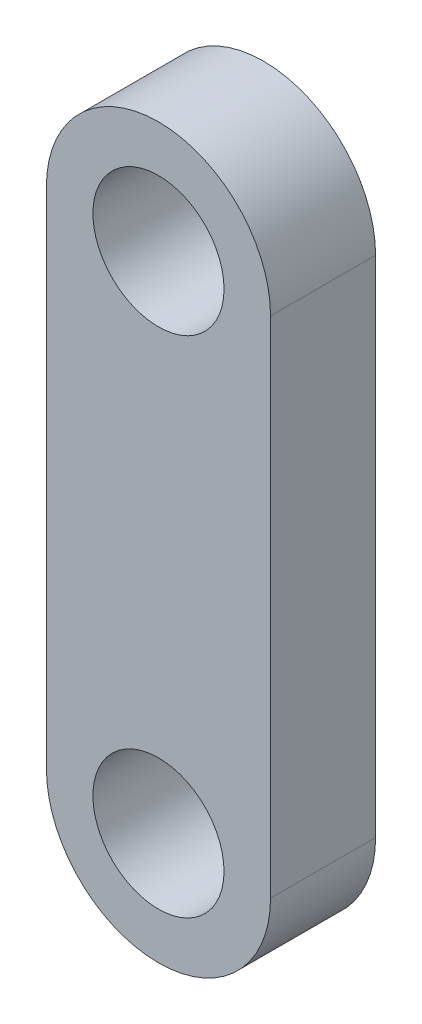
ISO-10303-21;
HEADER;
FILE_DESCRIPTION(('STEP AP214'),'2;1');
FILE_NAME('part.step','',(''),(''),'','','');
FILE_SCHEMA(('AUTOMOTIVE_DESIGN { 1 0 10303 214 1 1 1 1 }'));
ENDSEC;
DATA;
#1=APPLICATION_CONTEXT('core data for automotive mechanical design processes');
#2=APPLICATION_PROTOCOL_DEFINITION('international standard','automotive_design',2000,#1);
#3=PRODUCT_CONTEXT('',#1,'mechanical');
#4=PRODUCT('Part','Part','',(#3));
#5=PRODUCT_RELATED_PRODUCT_CATEGORY('part','',(#4));
#6=PRODUCT_DEFINITION_FORMATION('','',#4);
#7=PRODUCT_DEFINITION_CONTEXT('part definition',#1,'design');
#8=PRODUCT_DEFINITION('design','',#6,#7);
#9=PRODUCT_DEFINITION_SHAPE('','',#8);
#10=(LENGTH_UNIT() NAMED_UNIT(*) SI_UNIT(.MILLI.,.METRE.));
#11=(NAMED_UNIT(*) PLANE_ANGLE_UNIT() SI_UNIT($,.RADIAN.));
#12=(NAMED_UNIT(*) SI_UNIT($,.STERADIAN.) SOLID_ANGLE_UNIT());
#13=UNCERTAINTY_MEASURE_WITH_UNIT(LENGTH_MEASURE(1.E-05),#10,'distance_accuracy_value','');
#14=(GEOMETRIC_REPRESENTATION_CONTEXT(3) GLOBAL_UNCERTAINTY_ASSIGNED_CONTEXT((#13)) GLOBAL_UNIT_ASSIGNED_CONTEXT((#10,
#11,#12)) REPRESENTATION_CONTEXT('',''));
#15=CARTESIAN_POINT('',(0.,0.,0.));
#16=DIRECTION('',(0.,0.,1.));
#17=DIRECTION('',(1.,0.,0.));
#18=AXIS2_PLACEMENT_3D('',#15,#16,#17);
#19=CARTESIAN_POINT('',(0.,14.4,3.));
#20=DIRECTION('',(0.,0.,1.));
#21=DIRECTION('',(1.,0.,0.));
#22=AXIS2_PLACEMENT_3D('',#19,#20,#21);
#23=PLANE('',#22);
#24=CARTESIAN_POINT('',(0.,0.,3.));
#25=DIRECTION('',(0.,0.,1.));
#26=DIRECTION('',(1.,0.,0.));
#27=AXIS2_PLACEMENT_3D('',#24,#25,#26);
#28=CIRCLE('',#27,1.872);
#29=CARTESIAN_POINT('',(1.872,0.,3.));
#30=VERTEX_POINT('',#29);
#31=EDGE_CURVE('E108',#30,#30,#28,.T.);
#32=ORIENTED_EDGE('',*,*,#31,.F.);
#33=EDGE_LOOP('',(#32));
#34=FACE_BOUND('',#33,.T.);
#35=CARTESIAN_POINT('',(0.,14.4,3.));
#36=DIRECTION('',(0.,0.,1.));
#37=DIRECTION('',(1.,0.,0.));
#38=AXIS2_PLACEMENT_3D('',#35,#36,#37);
#39=CIRCLE('',#38,3.2);
#40=CARTESIAN_POINT('',(3.2,14.4,3.));
#41=VERTEX_POINT('',#40);
#42=CARTESIAN_POINT('',(-3.2,14.4,3.));
#43=VERTEX_POINT('',#42);
#44=EDGE_CURVE('E93',#41,#43,#39,.T.);
#45=ORIENTED_EDGE('',*,*,#44,.T.);
#46=DIRECTION('',(0.,-1.,0.));
#47=VECTOR('',#46,1.);
#48=CARTESIAN_POINT('',(-3.2,14.4,3.));
#49=LINE('',#48,#47);
#50=CARTESIAN_POINT('',(-3.2,0.,3.));
#51=VERTEX_POINT('',#50);
#52=EDGE_CURVE('E88',#43,#51,#49,.T.);
#53=ORIENTED_EDGE('',*,*,#52,.T.);
#54=CARTESIAN_POINT('',(0.,0.,3.));
#55=DIRECTION('',(0.,0.,1.));
#56=DIRECTION('',(1.,0.,0.));
#57=AXIS2_PLACEMENT_3D('',#54,#55,#56);
#58=CIRCLE('',#57,3.2);
#59=CARTESIAN_POINT('',(3.19999999999999,0.,3.));
#60=VERTEX_POINT('',#59);
#61=EDGE_CURVE('E91',#51,#60,#58,.T.);
#62=ORIENTED_EDGE('',*,*,#61,.T.);
#63=DIRECTION('',(0.,1.,0.));
#64=VECTOR('',#63,1.);
#65=CARTESIAN_POINT('',(3.2,14.4,3.));
#66=LINE('',#65,#64);
#67=EDGE_CURVE('E58',#60,#41,#66,.T.);
#68=ORIENTED_EDGE('',*,*,#67,.T.);
#69=EDGE_LOOP('',(#45,#53,#62,#68));
#70=FACE_BOUND('',#69,.T.);
#71=CARTESIAN_POINT('',(0.,14.4,3.));
#72=DIRECTION('',(0.,0.,1.));
#73=DIRECTION('',(1.,0.,0.));
#74=AXIS2_PLACEMENT_3D('',#71,#72,#73);
#75=CIRCLE('',#74,1.872);
#76=CARTESIAN_POINT('',(1.872,14.4,3.));
#77=VERTEX_POINT('',#76);
#78=EDGE_CURVE('E123',#77,#77,#75,.T.);
#79=ORIENTED_EDGE('',*,*,#78,.F.);
#80=EDGE_LOOP('',(#79));
#81=FACE_BOUND('',#80,.T.);
#82=ADVANCED_FACE('F41',(#34,#70,#81),#23,.T.);
#83=CARTESIAN_POINT('',(0.,14.4,0.));
#84=DIRECTION('',(0.,0.,1.));
#85=DIRECTION('',(1.,0.,0.));
#86=AXIS2_PLACEMENT_3D('',#83,#84,#85);
#87=PLANE('',#86);
#88=CARTESIAN_POINT('',(0.,14.4,0.));
#89=DIRECTION('',(0.,0.,1.));
#90=DIRECTION('',(1.,0.,0.));
#91=AXIS2_PLACEMENT_3D('',#88,#89,#90);
#92=CIRCLE('',#91,3.2);
#93=CARTESIAN_POINT('',(3.2,14.4,0.));
#94=VERTEX_POINT('',#93);
#95=CARTESIAN_POINT('',(-3.2,14.4,0.));
#96=VERTEX_POINT('',#95);
#97=EDGE_CURVE('E105',#94,#96,#92,.T.);
#98=ORIENTED_EDGE('',*,*,#97,.F.);
#99=DIRECTION('',(0.,1.,0.));
#100=VECTOR('',#99,1.);
#101=CARTESIAN_POINT('',(3.2,14.4,0.));
#102=LINE('',#101,#100);
#103=CARTESIAN_POINT('',(3.19999999999999,0.,0.));
#104=VERTEX_POINT('',#103);
#105=EDGE_CURVE('E81',#104,#94,#102,.T.);
#106=ORIENTED_EDGE('',*,*,#105,.F.);
#107=CARTESIAN_POINT('',(0.,0.,0.));
#108=DIRECTION('',(0.,0.,1.));
#109=DIRECTION('',(1.,0.,0.));
#110=AXIS2_PLACEMENT_3D('',#107,#108,#109);
#111=CIRCLE('',#110,3.2);
#112=CARTESIAN_POINT('',(-3.2,0.,0.));
#113=VERTEX_POINT('',#112);
#114=EDGE_CURVE('E75',#113,#104,#111,.T.);
#115=ORIENTED_EDGE('',*,*,#114,.F.);
#116=DIRECTION('',(0.,-1.,0.));
#117=VECTOR('',#116,1.);
#118=CARTESIAN_POINT('',(-3.2,14.4,0.));
#119=LINE('',#118,#117);
#120=EDGE_CURVE('E97',#96,#113,#119,.T.);
#121=ORIENTED_EDGE('',*,*,#120,.F.);
#122=EDGE_LOOP('',(#98,#106,#115,#121));
#123=FACE_BOUND('',#122,.T.);
#124=CARTESIAN_POINT('',(0.,0.,0.));
#125=DIRECTION('',(0.,0.,1.));
#126=DIRECTION('',(1.,0.,0.));
#127=AXIS2_PLACEMENT_3D('',#124,#125,#126);
#128=CIRCLE('',#127,1.872);
#129=CARTESIAN_POINT('',(1.872,0.,0.));
#130=VERTEX_POINT('',#129);
#131=EDGE_CURVE('E120',#130,#130,#128,.T.);
#132=ORIENTED_EDGE('',*,*,#131,.T.);
#133=EDGE_LOOP('',(#132));
#134=FACE_BOUND('',#133,.T.);
#135=CARTESIAN_POINT('',(0.,14.4,0.));
#136=DIRECTION('',(0.,0.,1.));
#137=DIRECTION('',(1.,0.,0.));
#138=AXIS2_PLACEMENT_3D('',#135,#136,#137);
#139=CIRCLE('',#138,1.872);
#140=CARTESIAN_POINT('',(1.872,14.4,0.));
#141=VERTEX_POINT('',#140);
#142=EDGE_CURVE('E126',#141,#141,#139,.T.);
#143=ORIENTED_EDGE('',*,*,#142,.T.);
#144=EDGE_LOOP('',(#143));
#145=FACE_BOUND('',#144,.T.);
#146=ADVANCED_FACE('F116',(#123,#134,#145),#87,.F.);
#147=CARTESIAN_POINT('',(0.,14.4,3.));
#148=DIRECTION('',(0.,0.,-1.));
#149=DIRECTION('',(-1.,0.,0.));
#150=AXIS2_PLACEMENT_3D('',#147,#148,#149);
#151=CYLINDRICAL_SURFACE('',#150,3.2);
#152=ORIENTED_EDGE('',*,*,#97,.T.);
#153=DIRECTION('',(0.,0.,-1.));
#154=VECTOR('',#153,1.);
#155=CARTESIAN_POINT('',(-3.2,14.4,3.));
#156=LINE('',#155,#154);
#157=EDGE_CURVE('E11',#43,#96,#156,.T.);
#158=ORIENTED_EDGE('',*,*,#157,.F.);
#159=ORIENTED_EDGE('',*,*,#44,.F.);
#160=DIRECTION('',(0.,0.,-1.));
#161=VECTOR('',#160,1.);
#162=CARTESIAN_POINT('',(3.2,14.4,3.));
#163=LINE('',#162,#161);
#164=EDGE_CURVE('E101',#41,#94,#163,.T.);
#165=ORIENTED_EDGE('',*,*,#164,.T.);
#166=EDGE_LOOP('',(#152,#158,#159,#165));
#167=FACE_BOUND('',#166,.T.);
#168=ADVANCED_FACE('F43',(#167),#151,.T.);
#169=CARTESIAN_POINT('',(-3.2,14.4,3.));
#170=DIRECTION('',(1.,0.,0.));
#171=DIRECTION('',(0.,1.,0.));
#172=AXIS2_PLACEMENT_3D('',#169,#170,#171);
#173=PLANE('',#172);
#174=ORIENTED_EDGE('',*,*,#120,.T.);
#175=DIRECTION('',(0.,0.,-1.));
#176=VECTOR('',#175,1.);
#177=CARTESIAN_POINT('',(-3.2,0.,3.));
#178=LINE('',#177,#176);
#179=EDGE_CURVE('E50',#51,#113,#178,.T.);
#180=ORIENTED_EDGE('',*,*,#179,.F.);
#181=ORIENTED_EDGE('',*,*,#52,.F.);
#182=ORIENTED_EDGE('',*,*,#157,.T.);
#183=EDGE_LOOP('',(#174,#180,#181,#182));
#184=FACE_BOUND('',#183,.T.);
#185=ADVANCED_FACE('F96',(#184),#173,.F.);
#186=CARTESIAN_POINT('',(0.,0.,3.));
#187=DIRECTION('',(0.,0.,-1.));
#188=DIRECTION('',(-1.,0.,0.));
#189=AXIS2_PLACEMENT_3D('',#186,#187,#188);
#190=CYLINDRICAL_SURFACE('',#189,3.2);
#191=ORIENTED_EDGE('',*,*,#114,.T.);
#192=DIRECTION('',(0.,0.,-1.));
#193=VECTOR('',#192,1.);
#194=CARTESIAN_POINT('',(3.19999999999999,0.,3.));
#195=LINE('',#194,#193);
#196=EDGE_CURVE('E98',#60,#104,#195,.T.);
#197=ORIENTED_EDGE('',*,*,#196,.F.);
#198=ORIENTED_EDGE('',*,*,#61,.F.);
#199=ORIENTED_EDGE('',*,*,#179,.T.);
#200=EDGE_LOOP('',(#191,#197,#198,#199));
#201=FACE_BOUND('',#200,.T.);
#202=ADVANCED_FACE('F99',(#201),#190,.T.);
#203=CARTESIAN_POINT('',(3.2,14.4,3.));
#204=DIRECTION('',(-1.,0.,0.));
#205=DIRECTION('',(0.,-1.,0.));
#206=AXIS2_PLACEMENT_3D('',#203,#204,#205);
#207=PLANE('',#206);
#208=ORIENTED_EDGE('',*,*,#105,.T.);
#209=ORIENTED_EDGE('',*,*,#164,.F.);
#210=ORIENTED_EDGE('',*,*,#67,.F.);
#211=ORIENTED_EDGE('',*,*,#196,.T.);
#212=EDGE_LOOP('',(#208,#209,#210,#211));
#213=FACE_BOUND('',#212,.T.);
#214=ADVANCED_FACE('F113',(#213),#207,.F.);
#215=CARTESIAN_POINT('',(0.,0.,3.));
#216=DIRECTION('',(0.,0.,-1.));
#217=DIRECTION('',(-1.,0.,0.));
#218=AXIS2_PLACEMENT_3D('',#215,#216,#217);
#219=CYLINDRICAL_SURFACE('',#218,1.872);
#220=ORIENTED_EDGE('',*,*,#31,.T.);
#221=EDGE_LOOP('',(#220));
#222=FACE_BOUND('',#221,.T.);
#223=ORIENTED_EDGE('',*,*,#131,.F.);
#224=EDGE_LOOP('',(#223));
#225=FACE_BOUND('',#224,.T.);
#226=ADVANCED_FACE('F143',(#222,#225),#219,.F.);
#227=CARTESIAN_POINT('',(0.,14.4,3.));
#228=DIRECTION('',(0.,0.,-1.));
#229=DIRECTION('',(-1.,0.,0.));
#230=AXIS2_PLACEMENT_3D('',#227,#228,#229);
#231=CYLINDRICAL_SURFACE('',#230,1.872);
#232=ORIENTED_EDGE('',*,*,#78,.T.);
#233=EDGE_LOOP('',(#232));
#234=FACE_BOUND('',#233,.T.);
#235=ORIENTED_EDGE('',*,*,#142,.F.);
#236=EDGE_LOOP('',(#235));
#237=FACE_BOUND('',#236,.T.);
#238=ADVANCED_FACE('F132',(#234,#237),#231,.F.);
#239=CLOSED_SHELL('',(#82,#146,#168,#185,#202,#214,#226,#238));
#240=MANIFOLD_SOLID_BREP('B2',#239);
#241=ADVANCED_BREP_SHAPE_REPRESENTATION('',(#18,#240),#14);
#242=SHAPE_DEFINITION_REPRESENTATION(#9,#241);
ENDSEC;
END-ISO-10303-21;
